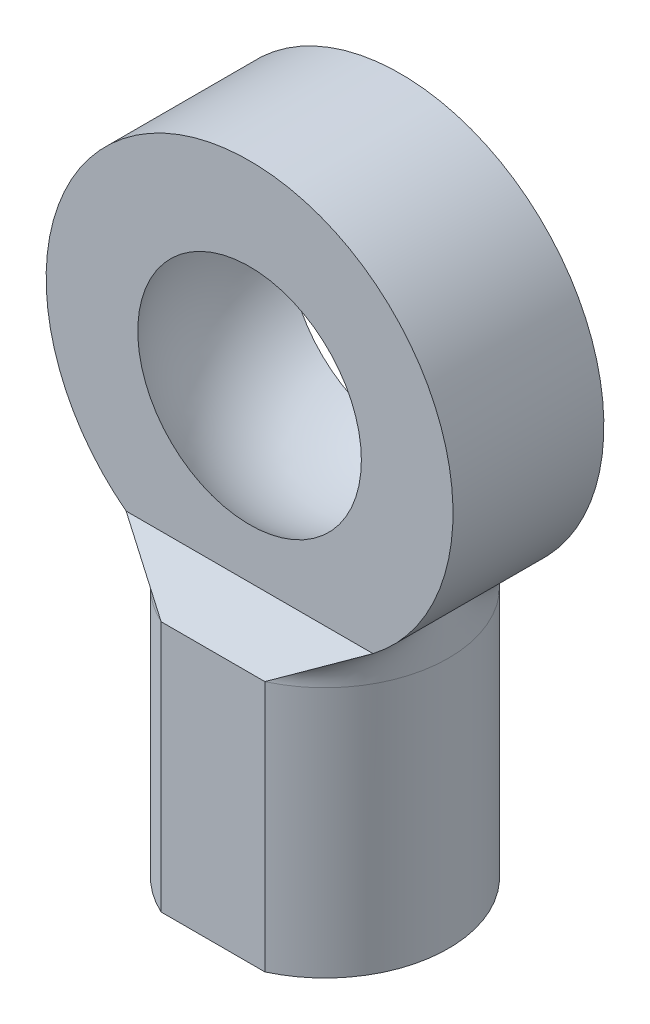
ISO-10303-21;
HEADER;
FILE_DESCRIPTION(('STEP AP214'),'2;1');
FILE_NAME('part.step','',(''),(''),'','','');
FILE_SCHEMA(('AUTOMOTIVE_DESIGN { 1 0 10303 214 1 1 1 1 }'));
ENDSEC;
DATA;
#1=APPLICATION_CONTEXT('core data for automotive mechanical design processes');
#2=APPLICATION_PROTOCOL_DEFINITION('international standard','automotive_design',2000,#1);
#3=PRODUCT_CONTEXT('',#1,'mechanical');
#4=PRODUCT('Part','Part','',(#3));
#5=PRODUCT_RELATED_PRODUCT_CATEGORY('part','',(#4));
#6=PRODUCT_DEFINITION_FORMATION('','',#4);
#7=PRODUCT_DEFINITION_CONTEXT('part definition',#1,'design');
#8=PRODUCT_DEFINITION('design','',#6,#7);
#9=PRODUCT_DEFINITION_SHAPE('','',#8);
#10=(LENGTH_UNIT() NAMED_UNIT(*) SI_UNIT(.MILLI.,.METRE.));
#11=(NAMED_UNIT(*) PLANE_ANGLE_UNIT() SI_UNIT($,.RADIAN.));
#12=(NAMED_UNIT(*) SI_UNIT($,.STERADIAN.) SOLID_ANGLE_UNIT());
#13=UNCERTAINTY_MEASURE_WITH_UNIT(LENGTH_MEASURE(1.E-05),#10,'distance_accuracy_value','');
#14=(GEOMETRIC_REPRESENTATION_CONTEXT(3) GLOBAL_UNCERTAINTY_ASSIGNED_CONTEXT((#13)) GLOBAL_UNIT_ASSIGNED_CONTEXT((#10,
#11,#12)) REPRESENTATION_CONTEXT('',''));
#15=CARTESIAN_POINT('',(0.,0.,0.));
#16=DIRECTION('',(0.,0.,1.));
#17=DIRECTION('',(1.,0.,0.));
#18=AXIS2_PLACEMENT_3D('',#15,#16,#17);
#19=CARTESIAN_POINT('',(0.,5.5,0.));
#20=DIRECTION('',(0.,-1.,0.));
#21=DIRECTION('',(0.,0.,-1.));
#22=AXIS2_PLACEMENT_3D('',#19,#20,#21);
#23=CYLINDRICAL_SURFACE('',#22,2.7);
#24=CARTESIAN_POINT('',(0.,0.,0.));
#25=DIRECTION('',(0.,1.,0.));
#26=DIRECTION('',(0.,0.,1.));
#27=AXIS2_PLACEMENT_3D('',#24,#25,#26);
#28=CIRCLE('',#27,2.7);
#29=CARTESIAN_POINT('',(-1.13468057179102,0.,-2.45));
#30=VERTEX_POINT('',#29);
#31=CARTESIAN_POINT('',(-1.13468057179102,0.,2.45));
#32=VERTEX_POINT('',#31);
#33=EDGE_CURVE('E400',#30,#32,#28,.T.);
#34=ORIENTED_EDGE('',*,*,#33,.T.);
#35=DIRECTION('',(0.,-1.,0.));
#36=VECTOR('',#35,1.);
#37=CARTESIAN_POINT('',(-1.13468057179102,5.5,2.45));
#38=LINE('',#37,#36);
#39=CARTESIAN_POINT('',(-1.13468057179102,5.5,2.45));
#40=VERTEX_POINT('',#39);
#41=EDGE_CURVE('E163',#40,#32,#38,.T.);
#42=ORIENTED_EDGE('',*,*,#41,.F.);
#43=CARTESIAN_POINT('',(-1.13468057179102,5.5,-2.45));
#44=CARTESIAN_POINT('',(-1.31994291747003,5.5,-2.36419853700963));
#45=CARTESIAN_POINT('',(-1.50938721833497,5.5,-2.25087135342619));
#46=CARTESIAN_POINT('',(-1.87386471531905,5.5,-1.95788218573791));
#47=CARTESIAN_POINT('',(-2.04871246976204,5.5,-1.77787453503162));
#48=CARTESIAN_POINT('',(-2.35120423008362,5.5,-1.35273771090675));
#49=CARTESIAN_POINT('',(-2.47832742831299,5.5,-1.10747105062858));
#50=CARTESIAN_POINT('',(-2.65299180588814,5.5,-0.574659418959781));
#51=CARTESIAN_POINT('',(-2.7,5.5,-0.2875076500792));
#52=CARTESIAN_POINT('',(-2.7,5.5,0.2875076500792));
#53=CARTESIAN_POINT('',(-2.65299180588814,5.5,0.574659418959781));
#54=CARTESIAN_POINT('',(-2.47832742831299,5.5,1.10747105062858));
#55=CARTESIAN_POINT('',(-2.35120423008362,5.5,1.35273771090676));
#56=CARTESIAN_POINT('',(-2.04871246976204,5.5,1.77787453503162));
#57=CARTESIAN_POINT('',(-1.87386471531905,5.5,1.95788218573791));
#58=CARTESIAN_POINT('',(-1.50938721833497,5.5,2.25087135342619));
#59=CARTESIAN_POINT('',(-1.31994291747003,5.5,2.36419853700963));
#60=CARTESIAN_POINT('',(-1.13468057179102,5.5,2.45));
#61=B_SPLINE_CURVE_WITH_KNOTS('',3,(#43,#44,#45,#46,#47,#48,#49,#50,#51,#52,#53,#54,#55,#56,#57,
#58,#59,#60),.UNSPECIFIED.,.F.,.F.,(4,2,2,2,2,2,2,2,4),(0.,0.125,0.25,0.375,0.5,0.625,0.75,
0.875,1.),.UNSPECIFIED.);
#62=CARTESIAN_POINT('',(-1.13468057179102,5.5,-2.45));
#63=VERTEX_POINT('',#62);
#64=EDGE_CURVE('E309',#63,#40,#61,.T.);
#65=ORIENTED_EDGE('',*,*,#64,.F.);
#66=DIRECTION('',(0.,-1.,0.));
#67=VECTOR('',#66,1.);
#68=CARTESIAN_POINT('',(-1.13468057179102,5.5,-2.45));
#69=LINE('',#68,#67);
#70=EDGE_CURVE('E418',#63,#30,#69,.T.);
#71=ORIENTED_EDGE('',*,*,#70,.T.);
#72=EDGE_LOOP('',(#34,#42,#65,#71));
#73=FACE_BOUND('',#72,.T.);
#74=ADVANCED_FACE('F67',(#73),#23,.T.);
#75=CARTESIAN_POINT('',(-1.13468057179102,5.5,2.45));
#76=DIRECTION('',(0.,0.,-1.));
#77=DIRECTION('',(-1.,0.,0.));
#78=AXIS2_PLACEMENT_3D('',#75,#76,#77);
#79=PLANE('',#78);
#80=DIRECTION('',(1.,0.,0.));
#81=VECTOR('',#80,1.);
#82=CARTESIAN_POINT('',(-1.13468057179102,0.,2.45));
#83=LINE('',#82,#81);
#84=CARTESIAN_POINT('',(1.13468057179102,0.,2.45));
#85=VERTEX_POINT('',#84);
#86=EDGE_CURVE('E407',#32,#85,#83,.T.);
#87=ORIENTED_EDGE('',*,*,#86,.T.);
#88=DIRECTION('',(0.,-1.,0.));
#89=VECTOR('',#88,1.);
#90=CARTESIAN_POINT('',(1.13468057179102,5.5,2.45));
#91=LINE('',#90,#89);
#92=CARTESIAN_POINT('',(1.13468057179102,5.5,2.45));
#93=VERTEX_POINT('',#92);
#94=EDGE_CURVE('E433',#93,#85,#91,.T.);
#95=ORIENTED_EDGE('',*,*,#94,.F.);
#96=DIRECTION('',(1.,0.,0.));
#97=VECTOR('',#96,1.);
#98=CARTESIAN_POINT('',(0.,5.5,2.45));
#99=LINE('',#98,#97);
#100=EDGE_CURVE('E319',#40,#93,#99,.T.);
#101=ORIENTED_EDGE('',*,*,#100,.F.);
#102=ORIENTED_EDGE('',*,*,#41,.T.);
#103=EDGE_LOOP('',(#87,#95,#101,#102));
#104=FACE_BOUND('',#103,.T.);
#105=ADVANCED_FACE('F454',(#104),#79,.F.);
#106=CARTESIAN_POINT('',(0.,5.5,0.));
#107=DIRECTION('',(0.,-1.,0.));
#108=DIRECTION('',(0.,0.,-1.));
#109=AXIS2_PLACEMENT_3D('',#106,#107,#108);
#110=CYLINDRICAL_SURFACE('',#109,2.7);
#111=CARTESIAN_POINT('',(0.,0.,0.));
#112=DIRECTION('',(0.,1.,0.));
#113=DIRECTION('',(0.,0.,1.));
#114=AXIS2_PLACEMENT_3D('',#111,#112,#113);
#115=CIRCLE('',#114,2.7);
#116=CARTESIAN_POINT('',(1.13468057179102,0.,-2.45));
#117=VERTEX_POINT('',#116);
#118=EDGE_CURVE('E410',#85,#117,#115,.T.);
#119=ORIENTED_EDGE('',*,*,#118,.T.);
#120=DIRECTION('',(0.,-1.,0.));
#121=VECTOR('',#120,1.);
#122=CARTESIAN_POINT('',(1.13468057179102,5.5,-2.45));
#123=LINE('',#122,#121);
#124=CARTESIAN_POINT('',(1.13468057179102,5.5,-2.45));
#125=VERTEX_POINT('',#124);
#126=EDGE_CURVE('E426',#125,#117,#123,.T.);
#127=ORIENTED_EDGE('',*,*,#126,.F.);
#128=CARTESIAN_POINT('',(1.13468057179102,5.5,2.45));
#129=CARTESIAN_POINT('',(1.31994291747003,5.5,2.36419853700963));
#130=CARTESIAN_POINT('',(1.50938721833497,5.5,2.25087135342619));
#131=CARTESIAN_POINT('',(1.87386471531905,5.5,1.95788218573791));
#132=CARTESIAN_POINT('',(2.04871246976204,5.5,1.77787453503162));
#133=CARTESIAN_POINT('',(2.35120423008362,5.5,1.35273771090676));
#134=CARTESIAN_POINT('',(2.47832742831299,5.5,1.10747105062858));
#135=CARTESIAN_POINT('',(2.65299180588814,5.5,0.574659418959781));
#136=CARTESIAN_POINT('',(2.7,5.5,0.2875076500792));
#137=CARTESIAN_POINT('',(2.7,5.5,-0.2875076500792));
#138=CARTESIAN_POINT('',(2.65299180588814,5.5,-0.574659418959781));
#139=CARTESIAN_POINT('',(2.47832742831298,5.5,-1.10747105062858));
#140=CARTESIAN_POINT('',(2.35120423008362,5.5,-1.35273771090675));
#141=CARTESIAN_POINT('',(2.04871246976204,5.5,-1.77787453503162));
#142=CARTESIAN_POINT('',(1.87386471531905,5.5,-1.95788218573791));
#143=CARTESIAN_POINT('',(1.50938721833497,5.5,-2.25087135342619));
#144=CARTESIAN_POINT('',(1.31994291747003,5.5,-2.36419853700963));
#145=CARTESIAN_POINT('',(1.13468057179102,5.5,-2.45));
#146=B_SPLINE_CURVE_WITH_KNOTS('',3,(#128,#129,#130,#131,#132,#133,#134,#135,#136,#137,#138,
#139,#140,#141,#142,#143,#144,#145),.UNSPECIFIED.,.F.,.F.,(4,2,2,2,2,2,2,2,4),(0.,0.125,0.25,
0.375,0.5,0.625,0.75,0.875,1.),.UNSPECIFIED.);
#147=EDGE_CURVE('E335',#93,#125,#146,.T.);
#148=ORIENTED_EDGE('',*,*,#147,.F.);
#149=ORIENTED_EDGE('',*,*,#94,.T.);
#150=EDGE_LOOP('',(#119,#127,#148,#149));
#151=FACE_BOUND('',#150,.T.);
#152=ADVANCED_FACE('F444',(#151),#110,.T.);
#153=CARTESIAN_POINT('',(-1.13468057179102,5.5,-2.45));
#154=DIRECTION('',(0.,0.,1.));
#155=DIRECTION('',(1.,0.,0.));
#156=AXIS2_PLACEMENT_3D('',#153,#154,#155);
#157=PLANE('',#156);
#158=DIRECTION('',(-1.,0.,0.));
#159=VECTOR('',#158,1.);
#160=CARTESIAN_POINT('',(-1.13468057179102,0.,-2.45));
#161=LINE('',#160,#159);
#162=EDGE_CURVE('E320',#117,#30,#161,.T.);
#163=ORIENTED_EDGE('',*,*,#162,.T.);
#164=ORIENTED_EDGE('',*,*,#70,.F.);
#165=DIRECTION('',(1.,0.,0.));
#166=VECTOR('',#165,1.);
#167=CARTESIAN_POINT('',(0.,5.5,-2.45));
#168=LINE('',#167,#166);
#169=EDGE_CURVE('E427',#125,#63,#168,.F.);
#170=ORIENTED_EDGE('',*,*,#169,.F.);
#171=ORIENTED_EDGE('',*,*,#126,.T.);
#172=EDGE_LOOP('',(#163,#164,#170,#171));
#173=FACE_BOUND('',#172,.T.);
#174=ADVANCED_FACE('F453',(#173),#157,.F.);
#175=CARTESIAN_POINT('',(0.,0.,0.));
#176=DIRECTION('',(0.,1.,0.));
#177=DIRECTION('',(0.,0.,1.));
#178=AXIS2_PLACEMENT_3D('',#175,#176,#177);
#179=PLANE('',#178);
#180=CARTESIAN_POINT('',(0.,0.,0.));
#181=DIRECTION('',(0.,1.,0.));
#182=DIRECTION('',(0.,0.,1.));
#183=AXIS2_PLACEMENT_3D('',#180,#181,#182);
#184=CIRCLE('',#183,1.5);
#185=CARTESIAN_POINT('',(0.,0.,1.5));
#186=VERTEX_POINT('',#185);
#187=EDGE_CURVE('E389',#186,#186,#184,.T.);
#188=ORIENTED_EDGE('',*,*,#187,.T.);
#189=EDGE_LOOP('',(#188));
#190=FACE_BOUND('',#189,.T.);
#191=ORIENTED_EDGE('',*,*,#33,.F.);
#192=ORIENTED_EDGE('',*,*,#162,.F.);
#193=ORIENTED_EDGE('',*,*,#118,.F.);
#194=ORIENTED_EDGE('',*,*,#86,.F.);
#195=EDGE_LOOP('',(#191,#192,#193,#194));
#196=FACE_BOUND('',#195,.T.);
#197=ADVANCED_FACE('F467',(#190,#196),#179,.F.);
#198=CARTESIAN_POINT('',(0.,4.5,0.));
#199=DIRECTION('',(0.,-1.,0.));
#200=DIRECTION('',(0.,0.,-1.));
#201=AXIS2_PLACEMENT_3D('',#198,#199,#200);
#202=CYLINDRICAL_SURFACE('',#201,1.5);
#203=CARTESIAN_POINT('',(0.,4.5,0.));
#204=DIRECTION('',(0.,1.,0.));
#205=DIRECTION('',(0.,0.,1.));
#206=AXIS2_PLACEMENT_3D('',#203,#204,#205);
#207=CIRCLE('',#206,1.5);
#208=CARTESIAN_POINT('',(0.,4.5,1.5));
#209=VERTEX_POINT('',#208);
#210=EDGE_CURVE('E396',#209,#209,#207,.T.);
#211=ORIENTED_EDGE('',*,*,#210,.T.);
#212=EDGE_LOOP('',(#211));
#213=FACE_BOUND('',#212,.T.);
#214=ORIENTED_EDGE('',*,*,#187,.F.);
#215=EDGE_LOOP('',(#214));
#216=FACE_BOUND('',#215,.T.);
#217=ADVANCED_FACE('F607',(#213,#216),#202,.F.);
#218=CARTESIAN_POINT('',(0.,4.5,0.));
#219=DIRECTION('',(0.,1.,0.));
#220=DIRECTION('',(0.,0.,1.));
#221=AXIS2_PLACEMENT_3D('',#218,#219,#220);
#222=PLANE('',#221);
#223=ORIENTED_EDGE('',*,*,#210,.F.);
#224=EDGE_LOOP('',(#223));
#225=FACE_BOUND('',#224,.T.);
#226=ADVANCED_FACE('F234',(#225),#222,.F.);
#227=CARTESIAN_POINT('',(-1.13468057179102,5.5,-2.45));
#228=CARTESIAN_POINT('',(-2.7,6.4126987688352,-1.65));
#229=CARTESIAN_POINT('',(-1.31994291747003,5.5,-2.36419853700963));
#230=CARTESIAN_POINT('',(-2.7,6.4126987688352,-1.5125));
#231=CARTESIAN_POINT('',(-1.50938721833497,5.5,-2.25087135342619));
#232=CARTESIAN_POINT('',(-2.7,6.4126987688352,-1.375));
#233=CARTESIAN_POINT('',(-1.87386471531905,5.5,-1.95788218573791));
#234=CARTESIAN_POINT('',(-2.7,6.4126987688352,-1.1));
#235=CARTESIAN_POINT('',(-2.04871246976204,5.5,-1.77787453503162));
#236=CARTESIAN_POINT('',(-2.7,6.4126987688352,-0.9625));
#237=CARTESIAN_POINT('',(-2.35120423008362,5.5,-1.35273771090675));
#238=CARTESIAN_POINT('',(-2.7,6.4126987688352,-0.6875));
#239=CARTESIAN_POINT('',(-2.47832742831299,5.5,-1.10747105062858));
#240=CARTESIAN_POINT('',(-2.7,6.4126987688352,-0.55));
#241=CARTESIAN_POINT('',(-2.65299180588814,5.5,-0.574659418959781));
#242=CARTESIAN_POINT('',(-2.7,6.4126987688352,-0.275));
#243=CARTESIAN_POINT('',(-2.7,5.5,-0.2875076500792));
#244=CARTESIAN_POINT('',(-2.7,6.4126987688352,-0.1375));
#245=CARTESIAN_POINT('',(-2.7,5.5,0.2875076500792));
#246=CARTESIAN_POINT('',(-2.7,6.4126987688352,0.1375));
#247=CARTESIAN_POINT('',(-2.65299180588814,5.5,0.574659418959781));
#248=CARTESIAN_POINT('',(-2.7,6.4126987688352,0.275));
#249=CARTESIAN_POINT('',(-2.47832742831299,5.5,1.10747105062858));
#250=CARTESIAN_POINT('',(-2.7,6.4126987688352,0.55));
#251=CARTESIAN_POINT('',(-2.35120423008362,5.5,1.35273771090676));
#252=CARTESIAN_POINT('',(-2.7,6.4126987688352,0.6875));
#253=CARTESIAN_POINT('',(-2.04871246976204,5.5,1.77787453503162));
#254=CARTESIAN_POINT('',(-2.7,6.4126987688352,0.9625));
#255=CARTESIAN_POINT('',(-1.87386471531905,5.5,1.95788218573791));
#256=CARTESIAN_POINT('',(-2.7,6.4126987688352,1.1));
#257=CARTESIAN_POINT('',(-1.50938721833497,5.5,2.25087135342619));
#258=CARTESIAN_POINT('',(-2.7,6.4126987688352,1.375));
#259=CARTESIAN_POINT('',(-1.31994291747003,5.5,2.36419853700963));
#260=CARTESIAN_POINT('',(-2.7,6.4126987688352,1.5125));
#261=CARTESIAN_POINT('',(-1.13468057179102,5.5,2.45));
#262=CARTESIAN_POINT('',(-2.7,6.4126987688352,1.65));
#263=B_SPLINE_SURFACE_WITH_KNOTS('',3,1,((#227,#228),(#229,#230),(#231,#232),(#233,#234),(#235,
#236),(#237,#238),(#239,#240),(#241,#242),(#243,#244),(#245,#246),(#247,#248),(#249,#250),(#251,
#252),(#253,#254),(#255,#256),(#257,#258),(#259,#260),(#261,#262)),.UNSPECIFIED.,.F.,.F.,.F.,(4,
2,2,2,2,2,2,2,4),(2,2),(0.,0.125,0.25,0.375,0.5,0.625,0.75,0.875,1.),(0.,1.),.UNSPECIFIED.);
#264=CARTESIAN_POINT('',(-2.40403661206455,6.20525595429365,-1.65));
#265=CARTESIAN_POINT('',(-2.47042896324407,6.2478824631205,-1.59275033324258));
#266=CARTESIAN_POINT('',(-2.53505439785131,6.2918583087694,-1.53448379125303));
#267=CARTESIAN_POINT('',(-2.62985236673937,6.36002500415014,-1.44541461004592));
#268=CARTESIAN_POINT('',(-2.66129584100551,6.38327577839404,-1.41524126039372));
#269=CARTESIAN_POINT('',(-2.69487466290756,6.40879103568015,-1.38235874045854));
#270=CARTESIAN_POINT('',(-2.69743880861592,6.41074383011654,-1.37984353034482));
#271=CARTESIAN_POINT('',(-2.7,6.41269876883521,-1.37732699455023));
#272=B_SPLINE_CURVE_WITH_KNOTS('',3,(#264,#265,#266,#267,#268,#269,#270,#271),.UNSPECIFIED.,.F.,
.F.,(4,2,2,4),(0.,0.292383511241084,0.440550136508977,0.452815151108947),.UNSPECIFIED.);
#273=CARTESIAN_POINT('',(-2.40403661206455,6.20525595429365,-1.65));
#274=VERTEX_POINT('',#273);
#275=CARTESIAN_POINT('',(-2.7,6.4126987688352,-1.37732699455023));
#276=VERTEX_POINT('',#275);
#277=EDGE_CURVE('E86',#274,#276,#272,.T.);
#278=CARTESIAN_POINT('',(-2.1371549206999,5.5,-1.6500000018001));
#279=CARTESIAN_POINT('',(-2.13622409062243,5.52813719171577,-1.65000000066355));
#280=CARTESIAN_POINT('',(-2.13574986846337,5.55627576426236,-1.65000000018185));
#281=CARTESIAN_POINT('',(-2.13625652024669,5.61268229892162,-1.6499999998172));
#282=CARTESIAN_POINT('',(-2.13724502178417,5.6409501675648,-1.6499999999374));
#283=CARTESIAN_POINT('',(-2.14327164632837,5.72617542304979,-1.65000000012627));
#284=CARTESIAN_POINT('',(-2.1514058222678,5.78307312802179,-1.65000000001822));
#285=CARTESIAN_POINT('',(-2.1711548235963,5.85762032198758,-1.6499999999936));
#286=CARTESIAN_POINT('',(-2.17708794143244,5.87678480560881,-1.64999999999829));
#287=CARTESIAN_POINT('',(-2.1906459437814,5.9145134339123,-1.65000000000171));
#288=CARTESIAN_POINT('',(-2.19827100634461,5.93307751517599,-1.65000000000046));
#289=CARTESIAN_POINT('',(-2.2151411069721,5.96927270161294,-1.64999999999955));
#290=CARTESIAN_POINT('',(-2.22437256218188,5.9869101316675,-1.64999999999987));
#291=CARTESIAN_POINT('',(-2.24438216964098,6.02128850458418,-1.65000000000013));
#292=CARTESIAN_POINT('',(-2.25516106503112,6.03802901137402,-1.65000000000005));
#293=CARTESIAN_POINT('',(-2.29625214162316,6.09632540327217,-1.64999999999988));
#294=CARTESIAN_POINT('',(-2.33045437182819,6.13517473459311,-1.64999999999998));
#295=CARTESIAN_POINT('',(-2.38593566258406,6.18927754475865,-1.65000000000001));
#296=CARTESIAN_POINT('',(-2.4052548507662,6.20670862198561,-1.65));
#297=CARTESIAN_POINT('',(-2.44493734025425,6.24034416870524,-1.65));
#298=CARTESIAN_POINT('',(-2.46530037406607,6.25654894983675,-1.65));
#299=CARTESIAN_POINT('',(-2.52044517465751,6.29823439617156,-1.65));
#300=CARTESIAN_POINT('',(-2.55590563569396,6.32280993314879,-1.65));
#301=CARTESIAN_POINT('',(-2.60974460103993,6.35785574606631,-1.65));
#302=CARTESIAN_POINT('',(-2.62761419047438,6.36912907410481,-1.65));
#303=CARTESIAN_POINT('',(-2.66361904745324,6.39123034160697,-1.65));
#304=CARTESIAN_POINT('',(-2.68175422609788,6.40205842568452,-1.65));
#305=CARTESIAN_POINT('',(-2.7,6.4126987688352,-1.65));
#306=B_SPLINE_CURVE_WITH_KNOTS('',3,(#278,#279,#280,#281,#282,#283,#284,#285,#286,#287,#288,
#289,#290,#291,#292,#293,#294,#295,#296,#297,#298,#299,#300,#301,#302,#303,#304,#305),
.UNSPECIFIED.,.F.,.F.,(4,2,2,2,2,2,2,2,2,2,2,2,2,4),(0.,0.0844132958538959,0.169268331744522,
0.340420280159787,0.400535545817421,0.460657140656967,0.520293103399706,0.579957802048996,
0.734155151900927,0.812198649485833,0.890222246791474,1.01953724046621,1.08291888841515,
1.14627978491463),.UNSPECIFIED.);
#307=CARTESIAN_POINT('',(-2.7,6.4126987688352,-1.65));
#308=VERTEX_POINT('',#307);
#309=EDGE_CURVE('E512',#274,#308,#306,.T.);
#310=DIRECTION('',(0.790278775879382,-0.460791869559167,-0.403893933282926));
#311=VECTOR('',#310,1.);
#312=CARTESIAN_POINT('',(-1.91734028589551,5.9563493844176,-2.05));
#313=LINE('',#312,#311);
#314=EDGE_CURVE('E289',#308,#63,#313,.T.);
#315=DIRECTION('',(-0.790278775879382,0.460791869559167,-0.403893933282926));
#316=VECTOR('',#315,1.);
#317=CARTESIAN_POINT('',(-1.91734028589551,5.9563493844176,2.05));
#318=LINE('',#317,#316);
#319=CARTESIAN_POINT('',(-2.7,6.4126987688352,1.65));
#320=VERTEX_POINT('',#319);
#321=EDGE_CURVE('E306',#40,#320,#318,.T.);
#322=CARTESIAN_POINT('',(-2.13715492240369,5.5,1.65000000069717));
#323=CARTESIAN_POINT('',(-2.13622409124958,5.52813719173837,1.65000000025699));
#324=CARTESIAN_POINT('',(-2.13574986863443,5.55627576431612,1.65000000007043));
#325=CARTESIAN_POINT('',(-2.13625652007628,5.61268229903111,1.6499999999292));
#326=CARTESIAN_POINT('',(-2.13724502173065,5.64095016769891,1.64999999997575));
#327=CARTESIAN_POINT('',(-2.1432716464657,5.72617542319682,1.6500000000489));
#328=CARTESIAN_POINT('',(-2.15140582231031,5.78307312815435,1.65000000000705));
#329=CARTESIAN_POINT('',(-2.17115482362554,5.85762032210765,1.64999999999752));
#330=CARTESIAN_POINT('',(-2.17708794147039,5.87678480573042,1.64999999999934));
#331=CARTESIAN_POINT('',(-2.19064594383082,5.91451343403386,1.65000000000066));
#332=CARTESIAN_POINT('',(-2.19827100639655,5.93307751529602,1.65000000000018));
#333=CARTESIAN_POINT('',(-2.21514110703302,5.96927270173511,1.64999999999982));
#334=CARTESIAN_POINT('',(-2.22437256224973,5.9869101317931,1.64999999999995));
#335=CARTESIAN_POINT('',(-2.24438216972299,6.02128850471601,1.65000000000005));
#336=CARTESIAN_POINT('',(-2.25516106512036,6.03802901150866,1.65000000000002));
#337=CARTESIAN_POINT('',(-2.2962521417449,6.09632540342425,1.64999999999995));
#338=CARTESIAN_POINT('',(-2.33045437197788,6.13517473475667,1.64999999999999));
#339=CARTESIAN_POINT('',(-2.38593566277297,6.18927754493386,1.65));
#340=CARTESIAN_POINT('',(-2.40525485096608,6.20670862216258,1.65));
#341=CARTESIAN_POINT('',(-2.44493734047578,6.24034416888554,1.65));
#342=CARTESIAN_POINT('',(-2.46530037429826,6.25654895001862,1.65));
#343=CARTESIAN_POINT('',(-2.52044517486109,6.29823439631483,1.65));
#344=CARTESIAN_POINT('',(-2.5559056358545,6.32280993325651,1.65));
#345=CARTESIAN_POINT('',(-2.60974460113688,6.35785574612786,1.65));
#346=CARTESIAN_POINT('',(-2.62761419055232,6.36912907415331,1.65));
#347=CARTESIAN_POINT('',(-2.66361904749261,6.39123034163048,1.65));
#348=CARTESIAN_POINT('',(-2.68175422611769,6.40205842569607,1.65));
#349=CARTESIAN_POINT('',(-2.7,6.4126987688352,1.65));
#350=B_SPLINE_CURVE_WITH_KNOTS('',3,(#322,#323,#324,#325,#326,#327,#328,#329,#330,#331,#332,
#333,#334,#335,#336,#337,#338,#339,#340,#341,#342,#343,#344,#345,#346,#347,#348,#349),
.UNSPECIFIED.,.F.,.F.,(4,2,2,2,2,2,2,2,2,2,2,2,2,4),(0.,0.0844132959658626,0.169268331925879,
0.340420280305444,0.40053554597108,0.460657140810667,0.520293103571659,0.579957802239832,
0.734155152172087,0.812198649785062,0.890222247118677,1.01953724062719,1.08291888850705,
1.14627978493776),.UNSPECIFIED.);
#351=CARTESIAN_POINT('',(-2.40403661206455,6.20525595429365,1.65));
#352=VERTEX_POINT('',#351);
#353=EDGE_CURVE('E93',#352,#320,#350,.T.);
#354=CARTESIAN_POINT('',(-2.40403661206455,6.20525595429365,1.65));
#355=CARTESIAN_POINT('',(-2.47042896324526,6.24788246312366,1.59275033324577));
#356=CARTESIAN_POINT('',(-2.53505439785203,6.29185830877073,1.53448379125387));
#357=CARTESIAN_POINT('',(-2.62985236673955,6.36002500414986,1.44541461004495));
#358=CARTESIAN_POINT('',(-2.66129584100541,6.38327577839331,1.41524126039258));
#359=CARTESIAN_POINT('',(-2.69487466290751,6.40879103568002,1.38235874045839));
#360=CARTESIAN_POINT('',(-2.69743880861589,6.41074383011647,1.37984353034474));
#361=CARTESIAN_POINT('',(-2.7,6.4126987688352,1.37732699455023));
#362=B_SPLINE_CURVE_WITH_KNOTS('',3,(#354,#355,#356,#357,#358,#359,#360,#361),.UNSPECIFIED.,.F.,
.F.,(4,2,2,4),(0.,0.292383511241945,0.44055013650897,0.452815151108938),.UNSPECIFIED.);
#363=CARTESIAN_POINT('',(-2.7,6.4126987688352,1.37732699455023));
#364=VERTEX_POINT('',#363);
#365=EDGE_CURVE('E275',#364,#352,#362,.F.);
#366=CARTESIAN_POINT('',(-2.7,6.4126987688352,1.65));
#367=CARTESIAN_POINT('',(-2.7,6.4126987688352,1.5125));
#368=CARTESIAN_POINT('',(-2.7,6.4126987688352,1.375));
#369=CARTESIAN_POINT('',(-2.7,6.4126987688352,1.1));
#370=CARTESIAN_POINT('',(-2.7,6.4126987688352,0.962500000000001));
#371=CARTESIAN_POINT('',(-2.7,6.4126987688352,0.687500000000001));
#372=CARTESIAN_POINT('',(-2.7,6.4126987688352,0.55));
#373=CARTESIAN_POINT('',(-2.7,6.4126987688352,0.275));
#374=CARTESIAN_POINT('',(-2.7,6.4126987688352,0.1375));
#375=CARTESIAN_POINT('',(-2.7,6.4126987688352,-0.1375));
#376=CARTESIAN_POINT('',(-2.7,6.4126987688352,-0.275));
#377=CARTESIAN_POINT('',(-2.7,6.4126987688352,-0.55));
#378=CARTESIAN_POINT('',(-2.7,6.4126987688352,-0.687500000000001));
#379=CARTESIAN_POINT('',(-2.7,6.4126987688352,-0.962500000000001));
#380=CARTESIAN_POINT('',(-2.7,6.4126987688352,-1.1));
#381=CARTESIAN_POINT('',(-2.7,6.4126987688352,-1.375));
#382=CARTESIAN_POINT('',(-2.7,6.4126987688352,-1.5125));
#383=CARTESIAN_POINT('',(-2.7,6.4126987688352,-1.65));
#384=B_SPLINE_CURVE_WITH_KNOTS('',3,(#366,#367,#368,#369,#370,#371,#372,#373,#374,#375,#376,
#377,#378,#379,#380,#381,#382,#383),.UNSPECIFIED.,.F.,.F.,(4,2,2,2,2,2,2,2,4),(0.,0.125,0.25,
0.375,0.5,0.625,0.75,0.875,1.),.UNSPECIFIED.);
#385=EDGE_CURVE('E279',#276,#364,#384,.F.);
#386=ORIENTED_EDGE('',*,*,#277,.F.);
#387=ORIENTED_EDGE('',*,*,#309,.T.);
#388=ORIENTED_EDGE('',*,*,#314,.T.);
#389=ORIENTED_EDGE('',*,*,#64,.T.);
#390=ORIENTED_EDGE('',*,*,#321,.T.);
#391=ORIENTED_EDGE('',*,*,#353,.F.);
#392=ORIENTED_EDGE('',*,*,#365,.F.);
#393=ORIENTED_EDGE('',*,*,#385,.F.);
#394=EDGE_LOOP('',(#386,#387,#388,#389,#390,#391,#392,#393));
#395=FACE_BOUND('',#394,.T.);
#396=ADVANCED_FACE('F227',(#395),#263,.T.);
#397=CARTESIAN_POINT('',(0.,3.60408754623184,4.1118078327751));
#398=DIRECTION('',(0.,0.659152352425485,0.752009425666959));
#399=DIRECTION('',(0.,-0.752009425666959,0.659152352425485));
#400=AXIS2_PLACEMENT_3D('',#397,#398,#399);
#401=PLANE('',#400);
#402=DIRECTION('',(0.790278775879382,0.460791869559167,-0.403893933282926));
#403=VECTOR('',#402,1.);
#404=CARTESIAN_POINT('',(1.13468057179102,5.5,2.45));
#405=LINE('',#404,#403);
#406=CARTESIAN_POINT('',(2.7,6.4126987688352,1.65));
#407=VERTEX_POINT('',#406);
#408=EDGE_CURVE('E300',#93,#407,#405,.T.);
#409=ORIENTED_EDGE('',*,*,#408,.T.);
#410=DIRECTION('',(1.,0.,0.));
#411=VECTOR('',#410,1.);
#412=CARTESIAN_POINT('',(2.7,6.4126987688352,1.65));
#413=LINE('',#412,#411);
#414=EDGE_CURVE('E188',#320,#407,#413,.T.);
#415=ORIENTED_EDGE('',*,*,#414,.F.);
#416=ORIENTED_EDGE('',*,*,#321,.F.);
#417=ORIENTED_EDGE('',*,*,#100,.T.);
#418=EDGE_LOOP('',(#409,#415,#416,#417));
#419=FACE_BOUND('',#418,.T.);
#420=ADVANCED_FACE('F233',(#419),#401,.T.);
#421=CARTESIAN_POINT('',(0.,3.60408754623184,-4.1118078327751));
#422=DIRECTION('',(0.,0.659152352425485,-0.752009425666959));
#423=DIRECTION('',(0.,0.752009425666959,0.659152352425485));
#424=AXIS2_PLACEMENT_3D('',#421,#422,#423);
#425=PLANE('',#424);
#426=ORIENTED_EDGE('',*,*,#314,.F.);
#427=DIRECTION('',(-1.,0.,0.));
#428=VECTOR('',#427,1.);
#429=CARTESIAN_POINT('',(-2.7,6.4126987688352,-1.65));
#430=LINE('',#429,#428);
#431=CARTESIAN_POINT('',(2.7,6.4126987688352,-1.65));
#432=VERTEX_POINT('',#431);
#433=EDGE_CURVE('E390',#432,#308,#430,.T.);
#434=ORIENTED_EDGE('',*,*,#433,.F.);
#435=DIRECTION('',(0.790278775879382,0.460791869559167,0.403893933282926));
#436=VECTOR('',#435,1.);
#437=CARTESIAN_POINT('',(1.91734028589551,5.9563493844176,-2.05));
#438=LINE('',#437,#436);
#439=EDGE_CURVE('E296',#125,#432,#438,.T.);
#440=ORIENTED_EDGE('',*,*,#439,.F.);
#441=ORIENTED_EDGE('',*,*,#169,.T.);
#442=EDGE_LOOP('',(#426,#434,#440,#441));
#443=FACE_BOUND('',#442,.T.);
#444=ADVANCED_FACE('F350',(#443),#425,.T.);
#445=CARTESIAN_POINT('',(1.13468057179102,5.5,2.45));
#446=CARTESIAN_POINT('',(2.7,6.4126987688352,1.65));
#447=CARTESIAN_POINT('',(1.31994291747003,5.5,2.36419853700963));
#448=CARTESIAN_POINT('',(2.7,6.4126987688352,1.5125));
#449=CARTESIAN_POINT('',(1.50938721833497,5.5,2.25087135342619));
#450=CARTESIAN_POINT('',(2.7,6.4126987688352,1.375));
#451=CARTESIAN_POINT('',(1.87386471531905,5.5,1.95788218573791));
#452=CARTESIAN_POINT('',(2.7,6.4126987688352,1.1));
#453=CARTESIAN_POINT('',(2.04871246976204,5.5,1.77787453503162));
#454=CARTESIAN_POINT('',(2.7,6.4126987688352,0.962499999999999));
#455=CARTESIAN_POINT('',(2.35120423008362,5.5,1.35273771090676));
#456=CARTESIAN_POINT('',(2.7,6.4126987688352,0.687499999999999));
#457=CARTESIAN_POINT('',(2.47832742831299,5.5,1.10747105062858));
#458=CARTESIAN_POINT('',(2.7,6.4126987688352,0.549999999999999));
#459=CARTESIAN_POINT('',(2.65299180588814,5.5,0.574659418959781));
#460=CARTESIAN_POINT('',(2.7,6.4126987688352,0.274999999999999));
#461=CARTESIAN_POINT('',(2.7,5.5,0.2875076500792));
#462=CARTESIAN_POINT('',(2.7,6.4126987688352,0.137499999999999));
#463=CARTESIAN_POINT('',(2.7,5.5,-0.2875076500792));
#464=CARTESIAN_POINT('',(2.7,6.4126987688352,-0.137500000000001));
#465=CARTESIAN_POINT('',(2.65299180588814,5.5,-0.574659418959781));
#466=CARTESIAN_POINT('',(2.7,6.4126987688352,-0.275000000000001));
#467=CARTESIAN_POINT('',(2.47832742831298,5.5,-1.10747105062858));
#468=CARTESIAN_POINT('',(2.7,6.4126987688352,-0.550000000000001));
#469=CARTESIAN_POINT('',(2.35120423008362,5.5,-1.35273771090675));
#470=CARTESIAN_POINT('',(2.7,6.4126987688352,-0.687500000000001));
#471=CARTESIAN_POINT('',(2.04871246976204,5.5,-1.77787453503162));
#472=CARTESIAN_POINT('',(2.7,6.4126987688352,-0.962500000000001));
#473=CARTESIAN_POINT('',(1.87386471531905,5.5,-1.95788218573791));
#474=CARTESIAN_POINT('',(2.7,6.4126987688352,-1.1));
#475=CARTESIAN_POINT('',(1.50938721833497,5.5,-2.25087135342619));
#476=CARTESIAN_POINT('',(2.7,6.4126987688352,-1.375));
#477=CARTESIAN_POINT('',(1.31994291747003,5.5,-2.36419853700963));
#478=CARTESIAN_POINT('',(2.7,6.4126987688352,-1.5125));
#479=CARTESIAN_POINT('',(1.13468057179102,5.5,-2.45));
#480=CARTESIAN_POINT('',(2.7,6.4126987688352,-1.65));
#481=B_SPLINE_SURFACE_WITH_KNOTS('',3,1,((#445,#446),(#447,#448),(#449,#450),(#451,#452),(#453,
#454),(#455,#456),(#457,#458),(#459,#460),(#461,#462),(#463,#464),(#465,#466),(#467,#468),(#469,
#470),(#471,#472),(#473,#474),(#475,#476),(#477,#478),(#479,#480)),.UNSPECIFIED.,.F.,.F.,.F.,(4,
2,2,2,2,2,2,2,4),(2,2),(0.,0.125,0.25,0.375,0.5,0.625,0.75,0.875,1.),(0.,1.),.UNSPECIFIED.);
#482=CARTESIAN_POINT('',(2.40403661206455,6.20525595429365,-1.65));
#483=CARTESIAN_POINT('',(2.47042896324511,6.24788246312357,-1.59275033324555));
#484=CARTESIAN_POINT('',(2.53505439785199,6.2918583087707,-1.5344837912538));
#485=CARTESIAN_POINT('',(2.62985236673959,6.36002500414988,-1.445414610045));
#486=CARTESIAN_POINT('',(2.66129584100546,6.38327577839334,-1.41524126039265));
#487=CARTESIAN_POINT('',(2.69487466290752,6.40879103568002,-1.3823587404584));
#488=CARTESIAN_POINT('',(2.6974388086159,6.41074383011647,-1.37984353034475));
#489=CARTESIAN_POINT('',(2.7,6.4126987688352,-1.37732699455023));
#490=B_SPLINE_CURVE_WITH_KNOTS('',3,(#482,#483,#484,#485,#486,#487,#488,#489),.UNSPECIFIED.,.F.,
.F.,(4,2,2,4),(0.,0.292383511241948,0.440550136508969,0.452815151108936),.UNSPECIFIED.);
#491=CARTESIAN_POINT('',(2.7,6.4126987688352,-1.37732699455023));
#492=VERTEX_POINT('',#491);
#493=CARTESIAN_POINT('',(2.40403661206486,6.20525595429392,-1.65));
#494=VERTEX_POINT('',#493);
#495=EDGE_CURVE('E12',#492,#494,#490,.F.);
#496=DIRECTION('',(0.,0.,-1.));
#497=VECTOR('',#496,1.);
#498=CARTESIAN_POINT('',(2.7,6.4126987688352,1.65));
#499=LINE('',#498,#497);
#500=CARTESIAN_POINT('',(2.7,6.4126987688352,1.37732699455023));
#501=VERTEX_POINT('',#500);
#502=EDGE_CURVE('E71',#501,#492,#499,.T.);
#503=CARTESIAN_POINT('',(2.40403661206455,6.20525595429364,1.65));
#504=CARTESIAN_POINT('',(2.47042896324448,6.24788246312078,1.59275033324274));
#505=CARTESIAN_POINT('',(2.53505439785176,6.29185830876972,1.5344837912528));
#506=CARTESIAN_POINT('',(2.62985236673969,6.36002500415038,1.4454146100455));
#507=CARTESIAN_POINT('',(2.66129584100563,6.38327577839413,1.41524126039345));
#508=CARTESIAN_POINT('',(2.69487466290755,6.40879103568014,1.38235874045853));
#509=CARTESIAN_POINT('',(2.69743880861591,6.41074383011653,1.37984353034481));
#510=CARTESIAN_POINT('',(2.7,6.4126987688352,1.37732699455023));
#511=B_SPLINE_CURVE_WITH_KNOTS('',3,(#503,#504,#505,#506,#507,#508,#509,#510),.UNSPECIFIED.,.F.,
.F.,(4,2,2,4),(0.,0.292383511241952,0.440550136508972,0.45281515110894),.UNSPECIFIED.);
#512=CARTESIAN_POINT('',(2.4040366120649,6.20525595429387,1.65));
#513=VERTEX_POINT('',#512);
#514=EDGE_CURVE('E146',#513,#501,#511,.T.);
#515=CARTESIAN_POINT('',(2.7,6.4126987688352,1.65));
#516=CARTESIAN_POINT('',(2.66807881547898,6.39405106041486,1.65));
#517=CARTESIAN_POINT('',(2.63644549588731,6.37485324219144,1.65));
#518=CARTESIAN_POINT('',(2.57397082641604,6.33482330314921,1.65));
#519=CARTESIAN_POINT('',(2.54313528718522,6.31398216373271,1.65));
#520=CARTESIAN_POINT('',(2.48177684420692,6.26955804027163,1.65));
#521=CARTESIAN_POINT('',(2.45130506666987,6.24590340483949,1.65));
#522=CARTESIAN_POINT('',(2.39271788330456,6.19590217147749,1.65));
#523=CARTESIAN_POINT('',(2.36459686683511,6.16956233684891,1.65));
#524=CARTESIAN_POINT('',(2.32384379472357,6.12625213608757,1.65));
#525=CARTESIAN_POINT('',(2.30997116280878,6.11045016767102,1.65));
#526=CARTESIAN_POINT('',(2.28353046233722,6.0777805127739,1.65));
#527=CARTESIAN_POINT('',(2.27096241176186,6.0609128116092,1.65));
#528=CARTESIAN_POINT('',(2.24754324458753,6.02634009898917,1.65));
#529=CARTESIAN_POINT('',(2.23667185331366,6.00864889537687,1.65));
#530=CARTESIAN_POINT('',(2.21665339552829,5.97230992003515,1.65));
#531=CARTESIAN_POINT('',(2.20750661319579,5.95366199130059,1.65));
#532=CARTESIAN_POINT('',(2.19101825701583,5.91553865997475,1.65));
#533=CARTESIAN_POINT('',(2.18368055037801,5.89606158733233,1.65));
#534=CARTESIAN_POINT('',(2.17079770293933,5.85651869575003,1.65));
#535=CARTESIAN_POINT('',(2.16525352665035,5.83645256633682,1.65));
#536=CARTESIAN_POINT('',(2.15101052080645,5.77531583464924,1.65));
#537=CARTESIAN_POINT('',(2.14484421963067,5.73365379177316,1.65));
#538=CARTESIAN_POINT('',(2.13814901834782,5.65970108154926,1.65));
#539=CARTESIAN_POINT('',(2.13664564216233,5.62747328887974,1.65));
#540=CARTESIAN_POINT('',(2.13564149738455,5.56348038670283,1.65));
#541=CARTESIAN_POINT('',(2.13610990991982,5.53171588679255,1.65));
#542=CARTESIAN_POINT('',(2.13715492348926,5.49999999974813,1.65));
#543=B_SPLINE_CURVE_WITH_KNOTS('',3,(#515,#516,#517,#518,#519,#520,#521,#522,#523,#524,#525,
#526,#527,#528,#529,#530,#531,#532,#533,#534,#535,#536,#537,#538,#539,#540,#541,#542),
.UNSPECIFIED.,.F.,.F.,(4,2,2,2,2,2,2,2,2,2,2,2,2,4),(0.,0.110945847030998,0.222549782193757,
0.338167424293075,0.453500732413781,0.516527668835647,0.579555473860652,0.641760355006887,
0.703975477258026,0.766322463797488,0.8287029233292,0.954574436223323,1.05131195529058,
1.14654313625118),.UNSPECIFIED.);
#544=EDGE_CURVE('E150',#407,#513,#543,.T.);
#545=CARTESIAN_POINT('',(2.7,6.4126987688352,-1.65));
#546=CARTESIAN_POINT('',(2.66807881547895,6.39405106041484,-1.65));
#547=CARTESIAN_POINT('',(2.63644549588725,6.3748532421914,-1.65));
#548=CARTESIAN_POINT('',(2.57397082641592,6.33482330314913,-1.65));
#549=CARTESIAN_POINT('',(2.54313528718507,6.31398216373261,-1.65));
#550=CARTESIAN_POINT('',(2.48177684420678,6.26955804027152,-1.65));
#551=CARTESIAN_POINT('',(2.45130506666975,6.2459034048394,-1.65));
#552=CARTESIAN_POINT('',(2.39271788330451,6.19590217147743,-1.65));
#553=CARTESIAN_POINT('',(2.36459686683509,6.16956233684888,-1.65));
#554=CARTESIAN_POINT('',(2.32384379472358,6.12625213608758,-1.65));
#555=CARTESIAN_POINT('',(2.3099711628088,6.11045016767103,-1.65));
#556=CARTESIAN_POINT('',(2.28353046233725,6.07778051277395,-1.65));
#557=CARTESIAN_POINT('',(2.2709624117619,6.06091281160926,-1.65));
#558=CARTESIAN_POINT('',(2.24754324458757,6.02634009898923,-1.65));
#559=CARTESIAN_POINT('',(2.23667185331368,6.00864889537691,-1.65));
#560=CARTESIAN_POINT('',(2.2166533955283,5.97230992003517,-1.65));
#561=CARTESIAN_POINT('',(2.20750661319579,5.9536619913006,-1.65));
#562=CARTESIAN_POINT('',(2.19101825701581,5.9155386599747,-1.65));
#563=CARTESIAN_POINT('',(2.18368055037798,5.89606158733224,-1.65));
#564=CARTESIAN_POINT('',(2.17079770293928,5.85651869574984,-1.65));
#565=CARTESIAN_POINT('',(2.16525352665029,5.83645256633658,-1.65));
#566=CARTESIAN_POINT('',(2.15101052080642,5.77531583464904,-1.65));
#567=CARTESIAN_POINT('',(2.14484421963064,5.73365379177305,-1.65));
#568=CARTESIAN_POINT('',(2.1381490183502,5.65970108157531,-1.65));
#569=CARTESIAN_POINT('',(2.13664564216481,5.62747328893202,-1.65));
#570=CARTESIAN_POINT('',(2.1356414973846,5.56348038680667,-1.65));
#571=CARTESIAN_POINT('',(2.1361099099174,5.53171588692172,-1.65));
#572=CARTESIAN_POINT('',(2.13715492348399,5.49999999990246,-1.65));
#573=B_SPLINE_CURVE_WITH_KNOTS('',3,(#545,#546,#547,#548,#549,#550,#551,#552,#553,#554,#555,
#556,#557,#558,#559,#560,#561,#562,#563,#564,#565,#566,#567,#568,#569,#570,#571,#572),
.UNSPECIFIED.,.F.,.F.,(4,2,2,2,2,2,2,2,2,2,2,2,2,4),(0.,0.110945847031106,0.222549782193974,
0.338167424293187,0.453500732413788,0.516527668835606,0.579555473860563,0.641760355006847,
0.703975477258036,0.766322463797636,0.828702923329488,0.954574436223335,1.05131195521214,
1.14654313609683),.UNSPECIFIED.);
#574=EDGE_CURVE('E78',#432,#494,#573,.T.);
#575=ORIENTED_EDGE('',*,*,#495,.F.);
#576=ORIENTED_EDGE('',*,*,#502,.F.);
#577=ORIENTED_EDGE('',*,*,#514,.F.);
#578=ORIENTED_EDGE('',*,*,#544,.F.);
#579=ORIENTED_EDGE('',*,*,#408,.F.);
#580=ORIENTED_EDGE('',*,*,#147,.T.);
#581=ORIENTED_EDGE('',*,*,#439,.T.);
#582=ORIENTED_EDGE('',*,*,#574,.T.);
#583=EDGE_LOOP('',(#575,#576,#577,#578,#579,#580,#581,#582));
#584=FACE_BOUND('',#583,.T.);
#585=ADVANCED_FACE('F148',(#584),#481,.T.);
#586=CARTESIAN_POINT('',(0.,9.95,-1.65));
#587=DIRECTION('',(0.,0.,1.));
#588=DIRECTION('',(1.,0.,0.));
#589=AXIS2_PLACEMENT_3D('',#586,#587,#588);
#590=CYLINDRICAL_SURFACE('',#589,4.45);
#591=CARTESIAN_POINT('',(0.,9.95,-1.65));
#592=DIRECTION('',(0.,0.,1.));
#593=DIRECTION('',(1.,0.,0.));
#594=AXIS2_PLACEMENT_3D('',#591,#592,#593);
#595=CIRCLE('',#594,4.45);
#596=EDGE_CURVE('E177',#432,#308,#595,.T.);
#597=ORIENTED_EDGE('',*,*,#596,.T.);
#598=EDGE_CURVE('E225',#308,#274,#595,.T.);
#599=ORIENTED_EDGE('',*,*,#598,.T.);
#600=ORIENTED_EDGE('',*,*,#277,.T.);
#601=ORIENTED_EDGE('',*,*,#385,.T.);
#602=ORIENTED_EDGE('',*,*,#365,.T.);
#603=CARTESIAN_POINT('',(0.,9.95,1.65));
#604=DIRECTION('',(0.,0.,1.));
#605=DIRECTION('',(1.,0.,0.));
#606=AXIS2_PLACEMENT_3D('',#603,#604,#605);
#607=CIRCLE('',#606,4.45);
#608=EDGE_CURVE('E172',#320,#352,#607,.T.);
#609=ORIENTED_EDGE('',*,*,#608,.F.);
#610=EDGE_CURVE('E170',#407,#320,#607,.T.);
#611=ORIENTED_EDGE('',*,*,#610,.F.);
#612=EDGE_CURVE('E161',#513,#407,#607,.T.);
#613=ORIENTED_EDGE('',*,*,#612,.F.);
#614=ORIENTED_EDGE('',*,*,#514,.T.);
#615=ORIENTED_EDGE('',*,*,#502,.T.);
#616=ORIENTED_EDGE('',*,*,#495,.T.);
#617=EDGE_CURVE('E496',#494,#432,#595,.T.);
#618=ORIENTED_EDGE('',*,*,#617,.T.);
#619=EDGE_LOOP('',(#597,#599,#600,#601,#602,#609,#611,#613,#614,#615,#616,#618));
#620=FACE_BOUND('',#619,.T.);
#621=ADVANCED_FACE('F167',(#620),#590,.T.);
#622=CARTESIAN_POINT('',(0.,9.95,-1.65));
#623=DIRECTION('',(0.,0.,1.));
#624=DIRECTION('',(1.,0.,0.));
#625=AXIS2_PLACEMENT_3D('',#622,#623,#624);
#626=PLANE('',#625);
#627=ORIENTED_EDGE('',*,*,#309,.F.);
#628=ORIENTED_EDGE('',*,*,#598,.F.);
#629=EDGE_LOOP('',(#627,#628));
#630=FACE_BOUND('',#629,.T.);
#631=ADVANCED_FACE('F528',(#630),#626,.F.);
#632=ORIENTED_EDGE('',*,*,#433,.T.);
#633=ORIENTED_EDGE('',*,*,#596,.F.);
#634=EDGE_LOOP('',(#632,#633));
#635=FACE_BOUND('',#634,.T.);
#636=CARTESIAN_POINT('',(0.,9.95,-1.65));
#637=DIRECTION('',(0.,0.,1.));
#638=DIRECTION('',(1.,0.,0.));
#639=AXIS2_PLACEMENT_3D('',#636,#637,#638);
#640=CIRCLE('',#639,2.4454038521275);
#641=CARTESIAN_POINT('',(2.4454038521275,9.95,-1.65));
#642=VERTEX_POINT('',#641);
#643=EDGE_CURVE('E179',#642,#642,#640,.F.);
#644=ORIENTED_EDGE('',*,*,#643,.F.);
#645=EDGE_LOOP('',(#644));
#646=FACE_BOUND('',#645,.T.);
#647=ADVANCED_FACE('F529',(#635,#646),#626,.F.);
#648=CARTESIAN_POINT('',(0.,9.95,1.65));
#649=DIRECTION('',(0.,0.,1.));
#650=DIRECTION('',(1.,0.,0.));
#651=AXIS2_PLACEMENT_3D('',#648,#649,#650);
#652=PLANE('',#651);
#653=ORIENTED_EDGE('',*,*,#608,.T.);
#654=ORIENTED_EDGE('',*,*,#353,.T.);
#655=EDGE_LOOP('',(#653,#654));
#656=FACE_BOUND('',#655,.T.);
#657=ADVANCED_FACE('F205',(#656),#652,.T.);
#658=CARTESIAN_POINT('',(0.,9.95,1.65));
#659=DIRECTION('',(0.,0.,1.));
#660=DIRECTION('',(1.,0.,0.));
#661=AXIS2_PLACEMENT_3D('',#658,#659,#660);
#662=CIRCLE('',#661,2.4454038521275);
#663=CARTESIAN_POINT('',(2.4454038521275,9.95,1.65));
#664=VERTEX_POINT('',#663);
#665=EDGE_CURVE('E532',#664,#664,#662,.F.);
#666=ORIENTED_EDGE('',*,*,#665,.T.);
#667=EDGE_LOOP('',(#666));
#668=FACE_BOUND('',#667,.T.);
#669=ORIENTED_EDGE('',*,*,#610,.T.);
#670=ORIENTED_EDGE('',*,*,#414,.T.);
#671=EDGE_LOOP('',(#669,#670));
#672=FACE_BOUND('',#671,.T.);
#673=ADVANCED_FACE('F206',(#668,#672),#652,.T.);
#674=ORIENTED_EDGE('',*,*,#574,.F.);
#675=ORIENTED_EDGE('',*,*,#617,.F.);
#676=EDGE_LOOP('',(#674,#675));
#677=FACE_BOUND('',#676,.T.);
#678=ADVANCED_FACE('F204',(#677),#626,.F.);
#679=ORIENTED_EDGE('',*,*,#612,.T.);
#680=ORIENTED_EDGE('',*,*,#544,.T.);
#681=EDGE_LOOP('',(#679,#680));
#682=FACE_BOUND('',#681,.T.);
#683=ADVANCED_FACE('F160',(#682),#652,.T.);
#684=CARTESIAN_POINT('',(0.,9.95,0.));
#685=DIRECTION('',(0.,0.,-1.));
#686=DIRECTION('',(1.,0.,0.));
#687=AXIS2_PLACEMENT_3D('',#684,#685,#686);
#688=SPHERICAL_SURFACE('',#687,2.95);
#689=CARTESIAN_POINT('',(2.4454038521275,9.95,1.65));
#690=CARTESIAN_POINT('',(2.46580802603191,9.95,1.61976032753315));
#691=CARTESIAN_POINT('',(2.48565072504826,9.95,1.58914183412587));
#692=CARTESIAN_POINT('',(2.52418711473446,9.95,1.52719011531103));
#693=CARTESIAN_POINT('',(2.54288080540432,9.95,1.49585688990347));
#694=CARTESIAN_POINT('',(2.5790931198272,9.95,1.43251861696863));
#695=CARTESIAN_POINT('',(2.59661174358023,9.95,1.40051356944134));
#696=CARTESIAN_POINT('',(2.63044990628029,9.95,1.33587575018361));
#697=CARTESIAN_POINT('',(2.64676944522731,9.95,1.30324297845316));
#698=CARTESIAN_POINT('',(2.67818695696804,9.95,1.23739460190315));
#699=CARTESIAN_POINT('',(2.69328492976174,9.95,1.20417899708359));
#700=CARTESIAN_POINT('',(2.72223853926668,9.95,1.13721066642877));
#701=CARTESIAN_POINT('',(2.73609417597792,9.95,1.1034579405935));
#702=CARTESIAN_POINT('',(2.76254404482005,9.95,1.03546181404427));
#703=CARTESIAN_POINT('',(2.77513827695095,9.95,1.0012184133303));
#704=CARTESIAN_POINT('',(2.79904800614032,9.95,0.932288059738034));
#705=CARTESIAN_POINT('',(2.81036350319881,9.95,0.897601106859739));
#706=CARTESIAN_POINT('',(2.83170019083658,9.95,0.82783138166242));
#707=CARTESIAN_POINT('',(2.84172138141587,9.95,0.792748609343395));
#708=CARTESIAN_POINT('',(2.86045566594358,9.95,0.722235522773841));
#709=CARTESIAN_POINT('',(2.869168759892,9.95,0.686805208523313));
#710=CARTESIAN_POINT('',(2.88527486103924,9.95,0.615645793827145));
#711=CARTESIAN_POINT('',(2.89266786823806,9.95,0.579916693381506));
#712=CARTESIAN_POINT('',(2.90612362235323,9.95,0.508208873198924));
#713=CARTESIAN_POINT('',(2.91218636926958,9.95,0.472230153461981));
#714=CARTESIAN_POINT('',(2.92297325985835,9.95,0.40007260510044));
#715=CARTESIAN_POINT('',(2.92769740353076,9.95,0.363893776475842));
#716=CARTESIAN_POINT('',(2.93580058672618,9.95,0.291385796113469));
#717=CARTESIAN_POINT('',(2.93917962624919,9.95,0.255056644375694));
#718=CARTESIAN_POINT('',(2.94458795124122,9.95,0.182298010421314));
#719=CARTESIAN_POINT('',(2.94661723671025,9.95,0.145868528204709));
#720=CARTESIAN_POINT('',(2.94932326108964,9.95,0.0729593639920694));
#721=CARTESIAN_POINT('',(2.95,9.95,0.0364796819960347));
#722=CARTESIAN_POINT('',(2.95,9.95,-0.0364796819960347));
#723=CARTESIAN_POINT('',(2.94932326108964,9.95,-0.0729593639920694));
#724=CARTESIAN_POINT('',(2.94661723671025,9.95,-0.145868528204709));
#725=CARTESIAN_POINT('',(2.94458795124122,9.95,-0.182298010421314));
#726=CARTESIAN_POINT('',(2.93917962624919,9.95,-0.255056644375694));
#727=CARTESIAN_POINT('',(2.93580058672618,9.95,-0.291385796113469));
#728=CARTESIAN_POINT('',(2.92769740353076,9.95,-0.363893776475842));
#729=CARTESIAN_POINT('',(2.92297325985835,9.95,-0.40007260510044));
#730=CARTESIAN_POINT('',(2.91218636926958,9.95,-0.472230153461981));
#731=CARTESIAN_POINT('',(2.90612362235323,9.95,-0.508208873198924));
#732=CARTESIAN_POINT('',(2.89266786823806,9.95,-0.579916693381505));
#733=CARTESIAN_POINT('',(2.88527486103924,9.95,-0.615645793827145));
#734=CARTESIAN_POINT('',(2.869168759892,9.95,-0.686805208523313));
#735=CARTESIAN_POINT('',(2.86045566594358,9.95,-0.722235522773841));
#736=CARTESIAN_POINT('',(2.84172138141587,9.95,-0.792748609343395));
#737=CARTESIAN_POINT('',(2.83170019083658,9.95,-0.82783138166242));
#738=CARTESIAN_POINT('',(2.81036350319881,9.95,-0.897601106859739));
#739=CARTESIAN_POINT('',(2.79904800614032,9.95,-0.932288059738034));
#740=CARTESIAN_POINT('',(2.77513827695095,9.95,-1.0012184133303));
#741=CARTESIAN_POINT('',(2.76254404482005,9.95,-1.03546181404427));
#742=CARTESIAN_POINT('',(2.73609417597792,9.95,-1.1034579405935));
#743=CARTESIAN_POINT('',(2.72223853926668,9.95,-1.13721066642877));
#744=CARTESIAN_POINT('',(2.69328492976174,9.95,-1.20417899708359));
#745=CARTESIAN_POINT('',(2.67818695696804,9.95,-1.23739460190315));
#746=CARTESIAN_POINT('',(2.64676944522731,9.95,-1.30324297845316));
#747=CARTESIAN_POINT('',(2.63044990628029,9.95,-1.33587575018361));
#748=CARTESIAN_POINT('',(2.59661174358023,9.95,-1.40051356944134));
#749=CARTESIAN_POINT('',(2.5790931198272,9.95,-1.43251861696863));
#750=CARTESIAN_POINT('',(2.54288080540432,9.95,-1.49585688990347));
#751=CARTESIAN_POINT('',(2.52418711473446,9.95,-1.52719011531103));
#752=CARTESIAN_POINT('',(2.48565072504826,9.95,-1.58914183412587));
#753=CARTESIAN_POINT('',(2.46580802603191,9.95,-1.61976032753315));
#754=CARTESIAN_POINT('',(2.4454038521275,9.95,-1.65));
#755=B_SPLINE_CURVE_WITH_KNOTS('',3,(#689,#690,#691,#692,#693,#694,#695,#696,#697,#698,#699,
#700,#701,#702,#703,#704,#705,#706,#707,#708,#709,#710,#711,#712,#713,#714,#715,#716,#717,#718,
#719,#720,#721,#722,#723,#724,#725,#726,#727,#728,#729,#730,#731,#732,#733,#734,#735,#736,#737,
#738,#739,#740,#741,#742,#743,#744,#745,#746,#747,#748,#749,#750,#751,#752,#753,#754),
.UNSPECIFIED.,.F.,.F.,(4,2,2,2,2,2,2,2,2,2,2,2,2,2,2,2,2,2,2,2,2,2,2,2,2,2,2,2,2,2,2,2,4),(0.,
0.109432771555642,0.218865543111285,0.328298314666927,0.437731086222569,0.547163857778211,
0.656596629333854,0.766029400889496,0.875462172445138,0.984894944000781,1.09432771555642,
1.20376048711207,1.31319325866771,1.42262603022335,1.53205880177899,1.64149157333463,
1.75092434489028,1.86035711644592,1.96978988800156,2.0792226595572,2.18865543111285,
2.29808820266849,2.40752097422413,2.51695374577977,2.62638651733541,2.73581928889106,
2.8452520604467,2.95468483200234,3.06411760355798,3.17355037511363,3.28298314666927,
3.39241591822491,3.50184868978055),.UNSPECIFIED.);
#756=EDGE_CURVE('BSEAM203',#664,#642,#755,.T.);
#757=ORIENTED_EDGE('',*,*,#665,.F.);
#758=ORIENTED_EDGE('',*,*,#643,.T.);
#759=ORIENTED_EDGE('',*,*,#756,.T.);
#760=ORIENTED_EDGE('',*,*,#756,.F.);
#761=EDGE_LOOP('',(#757,#759,#758,#760));
#762=FACE_BOUND('',#761,.T.);
#763=ADVANCED_FACE('F203',(#762),#688,.F.);
#764=CLOSED_SHELL('',(#74,#105,#152,#174,#197,#217,#226,#396,#420,#444,#585,#621,#631,#647,#657,
#673,#678,#683,#763));
#765=MANIFOLD_SOLID_BREP('B2',#764);
#766=ADVANCED_BREP_SHAPE_REPRESENTATION('',(#18,#765),#14);
#767=SHAPE_DEFINITION_REPRESENTATION(#9,#766);
ENDSEC;
END-ISO-10303-21;
